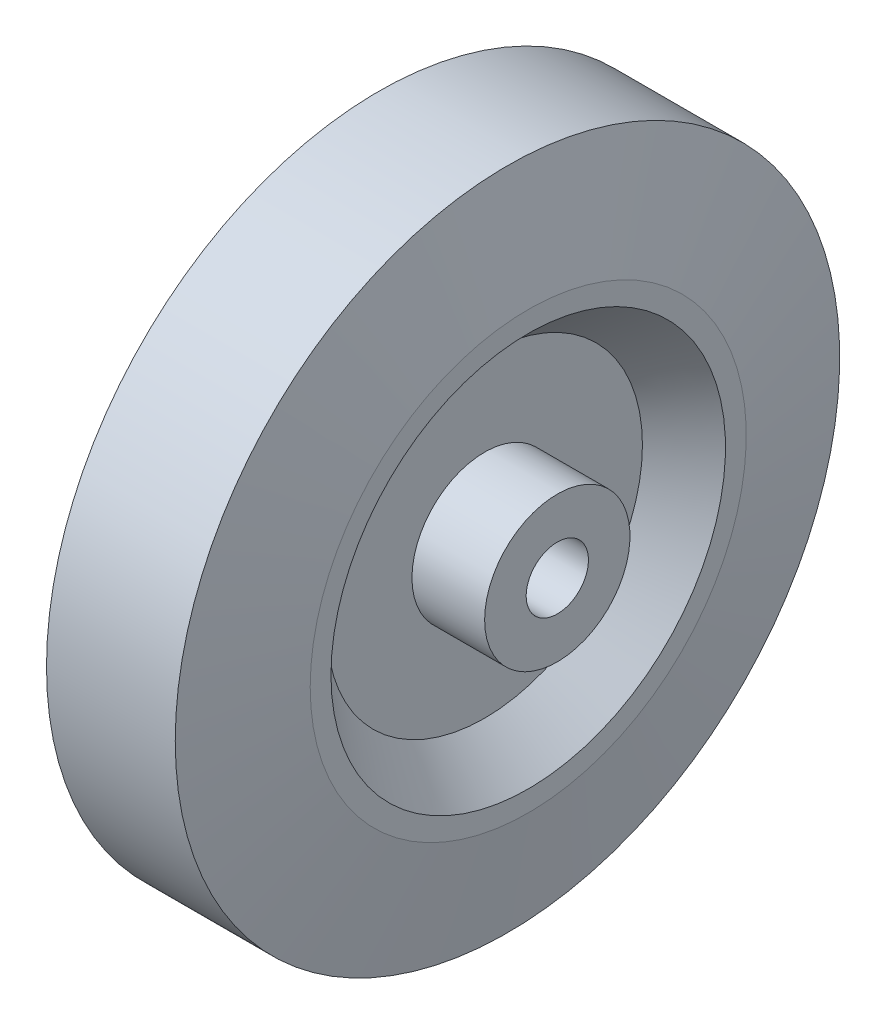
ISO-10303-21;
HEADER;
FILE_DESCRIPTION(('STEP AP214'),'2;1');
FILE_NAME('part.step','',(''),(''),'','','');
FILE_SCHEMA(('AUTOMOTIVE_DESIGN { 1 0 10303 214 1 1 1 1 }'));
ENDSEC;
DATA;
#1=APPLICATION_CONTEXT('core data for automotive mechanical design processes');
#2=APPLICATION_PROTOCOL_DEFINITION('international standard','automotive_design',2000,#1);
#3=PRODUCT_CONTEXT('',#1,'mechanical');
#4=PRODUCT('Part','Part','',(#3));
#5=PRODUCT_RELATED_PRODUCT_CATEGORY('part','',(#4));
#6=PRODUCT_DEFINITION_FORMATION('','',#4);
#7=PRODUCT_DEFINITION_CONTEXT('part definition',#1,'design');
#8=PRODUCT_DEFINITION('design','',#6,#7);
#9=PRODUCT_DEFINITION_SHAPE('','',#8);
#10=(LENGTH_UNIT() NAMED_UNIT(*) SI_UNIT(.MILLI.,.METRE.));
#11=(NAMED_UNIT(*) PLANE_ANGLE_UNIT() SI_UNIT($,.RADIAN.));
#12=(NAMED_UNIT(*) SI_UNIT($,.STERADIAN.) SOLID_ANGLE_UNIT());
#13=UNCERTAINTY_MEASURE_WITH_UNIT(LENGTH_MEASURE(1.E-05),#10,'distance_accuracy_value','');
#14=(GEOMETRIC_REPRESENTATION_CONTEXT(3) GLOBAL_UNCERTAINTY_ASSIGNED_CONTEXT((#13)) GLOBAL_UNIT_ASSIGNED_CONTEXT((#10,
#11,#12)) REPRESENTATION_CONTEXT('',''));
#15=CARTESIAN_POINT('',(0.,0.,0.));
#16=DIRECTION('',(0.,0.,1.));
#17=DIRECTION('',(1.,0.,0.));
#18=AXIS2_PLACEMENT_3D('',#15,#16,#17);
#19=CARTESIAN_POINT('',(20.5,0.,0.));
#20=DIRECTION('',(-1.,0.,0.));
#21=DIRECTION('',(0.,0.,1.));
#22=AXIS2_PLACEMENT_3D('',#19,#20,#21);
#23=CONICAL_SURFACE('',#22,52.5,1.39094282700242);
#24=CARTESIAN_POINT('',(15.5,0.,0.));
#25=DIRECTION('',(-1.,0.,0.));
#26=DIRECTION('',(0.,0.,1.));
#27=AXIS2_PLACEMENT_3D('',#24,#25,#26);
#28=CIRCLE('',#27,80.);
#29=CARTESIAN_POINT('',(15.5,0.,80.));
#30=VERTEX_POINT('',#29);
#31=EDGE_CURVE('E10',#30,#30,#28,.T.);
#32=ORIENTED_EDGE('',*,*,#31,.F.);
#33=EDGE_LOOP('',(#32));
#34=FACE_BOUND('',#33,.T.);
#35=CARTESIAN_POINT('',(20.5,0.,0.));
#36=DIRECTION('',(-1.,0.,0.));
#37=DIRECTION('',(0.,0.,1.));
#38=AXIS2_PLACEMENT_3D('',#35,#36,#37);
#39=CIRCLE('',#38,52.5);
#40=CARTESIAN_POINT('',(20.5,0.,52.5));
#41=VERTEX_POINT('',#40);
#42=EDGE_CURVE('E79',#41,#41,#39,.T.);
#43=ORIENTED_EDGE('',*,*,#42,.T.);
#44=EDGE_LOOP('',(#43));
#45=FACE_BOUND('',#44,.T.);
#46=ADVANCED_FACE('F33',(#34,#45),#23,.T.);
#47=CARTESIAN_POINT('',(-30.7881952117865,0.,0.));
#48=DIRECTION('',(-1.,0.,0.));
#49=DIRECTION('',(0.,0.,1.));
#50=AXIS2_PLACEMENT_3D('',#47,#48,#49);
#51=CYLINDRICAL_SURFACE('',#50,80.);
#52=CARTESIAN_POINT('',(-15.5,0.,0.));
#53=DIRECTION('',(-1.,0.,0.));
#54=DIRECTION('',(0.,0.,1.));
#55=AXIS2_PLACEMENT_3D('',#52,#53,#54);
#56=CIRCLE('',#55,80.);
#57=CARTESIAN_POINT('',(-15.5,0.,80.));
#58=VERTEX_POINT('',#57);
#59=EDGE_CURVE('E39',#58,#58,#56,.T.);
#60=ORIENTED_EDGE('',*,*,#59,.F.);
#61=EDGE_LOOP('',(#60));
#62=FACE_BOUND('',#61,.T.);
#63=ORIENTED_EDGE('',*,*,#31,.T.);
#64=EDGE_LOOP('',(#63));
#65=FACE_BOUND('',#64,.T.);
#66=ADVANCED_FACE('F152',(#62,#65),#51,.T.);
#67=CARTESIAN_POINT('',(-15.5,0.,0.));
#68=DIRECTION('',(1.,0.,0.));
#69=DIRECTION('',(0.,0.,-1.));
#70=AXIS2_PLACEMENT_3D('',#67,#68,#69);
#71=CONICAL_SURFACE('',#70,80.,1.39094282700242);
#72=CARTESIAN_POINT('',(-20.5,0.,0.));
#73=DIRECTION('',(-1.,0.,0.));
#74=DIRECTION('',(0.,0.,1.));
#75=AXIS2_PLACEMENT_3D('',#72,#73,#74);
#76=CIRCLE('',#75,52.5);
#77=CARTESIAN_POINT('',(-20.5,0.,52.5));
#78=VERTEX_POINT('',#77);
#79=EDGE_CURVE('E43',#78,#78,#76,.T.);
#80=ORIENTED_EDGE('',*,*,#79,.F.);
#81=EDGE_LOOP('',(#80));
#82=FACE_BOUND('',#81,.T.);
#83=ORIENTED_EDGE('',*,*,#59,.T.);
#84=EDGE_LOOP('',(#83));
#85=FACE_BOUND('',#84,.T.);
#86=ADVANCED_FACE('F147',(#82,#85),#71,.T.);
#87=CARTESIAN_POINT('',(-20.5,52.5,0.));
#88=DIRECTION('',(1.,0.,0.));
#89=DIRECTION('',(0.,0.,-1.));
#90=AXIS2_PLACEMENT_3D('',#87,#88,#89);
#91=PLANE('',#90);
#92=CARTESIAN_POINT('',(-20.5,0.,0.));
#93=DIRECTION('',(-1.,0.,0.));
#94=DIRECTION('',(0.,0.,1.));
#95=AXIS2_PLACEMENT_3D('',#92,#93,#94);
#96=CIRCLE('',#95,47.5);
#97=CARTESIAN_POINT('',(-20.5,0.,47.5));
#98=VERTEX_POINT('',#97);
#99=EDGE_CURVE('E47',#98,#98,#96,.T.);
#100=ORIENTED_EDGE('',*,*,#99,.F.);
#101=EDGE_LOOP('',(#100));
#102=FACE_BOUND('',#101,.T.);
#103=ORIENTED_EDGE('',*,*,#79,.T.);
#104=EDGE_LOOP('',(#103));
#105=FACE_BOUND('',#104,.T.);
#106=ADVANCED_FACE('F141',(#102,#105),#91,.F.);
#107=CARTESIAN_POINT('',(-20.5,0.,0.));
#108=DIRECTION('',(-1.,0.,0.));
#109=DIRECTION('',(0.,0.,1.));
#110=AXIS2_PLACEMENT_3D('',#107,#108,#109);
#111=CONICAL_SURFACE('',#110,47.5,0.735439767675506);
#112=CARTESIAN_POINT('',(-10.,0.,0.));
#113=DIRECTION('',(-1.,0.,0.));
#114=DIRECTION('',(0.,0.,1.));
#115=AXIS2_PLACEMENT_3D('',#112,#113,#114);
#116=CIRCLE('',#115,38.);
#117=CARTESIAN_POINT('',(-10.,0.,38.));
#118=VERTEX_POINT('',#117);
#119=EDGE_CURVE('E52',#118,#118,#116,.T.);
#120=ORIENTED_EDGE('',*,*,#119,.F.);
#121=EDGE_LOOP('',(#120));
#122=FACE_BOUND('',#121,.T.);
#123=ORIENTED_EDGE('',*,*,#99,.T.);
#124=EDGE_LOOP('',(#123));
#125=FACE_BOUND('',#124,.T.);
#126=ADVANCED_FACE('F135',(#122,#125),#111,.F.);
#127=CARTESIAN_POINT('',(-10.,38.,0.));
#128=DIRECTION('',(1.,0.,0.));
#129=DIRECTION('',(0.,0.,-1.));
#130=AXIS2_PLACEMENT_3D('',#127,#128,#129);
#131=PLANE('',#130);
#132=CARTESIAN_POINT('',(-10.,0.,0.));
#133=DIRECTION('',(-1.,0.,0.));
#134=DIRECTION('',(0.,0.,1.));
#135=AXIS2_PLACEMENT_3D('',#132,#133,#134);
#136=CIRCLE('',#135,17.5);
#137=CARTESIAN_POINT('',(-10.,0.,17.5));
#138=VERTEX_POINT('',#137);
#139=EDGE_CURVE('E55',#138,#138,#136,.T.);
#140=ORIENTED_EDGE('',*,*,#139,.F.);
#141=EDGE_LOOP('',(#140));
#142=FACE_BOUND('',#141,.T.);
#143=ORIENTED_EDGE('',*,*,#119,.T.);
#144=EDGE_LOOP('',(#143));
#145=FACE_BOUND('',#144,.T.);
#146=ADVANCED_FACE('F129',(#142,#145),#131,.F.);
#147=CARTESIAN_POINT('',(-30.7881952117865,0.,0.));
#148=DIRECTION('',(-1.,0.,0.));
#149=DIRECTION('',(0.,0.,1.));
#150=AXIS2_PLACEMENT_3D('',#147,#148,#149);
#151=CYLINDRICAL_SURFACE('',#150,17.5);
#152=CARTESIAN_POINT('',(-27.5,0.,0.));
#153=DIRECTION('',(-1.,0.,0.));
#154=DIRECTION('',(0.,0.,1.));
#155=AXIS2_PLACEMENT_3D('',#152,#153,#154);
#156=CIRCLE('',#155,17.5);
#157=CARTESIAN_POINT('',(-27.5,0.,17.5));
#158=VERTEX_POINT('',#157);
#159=EDGE_CURVE('E58',#158,#158,#156,.T.);
#160=ORIENTED_EDGE('',*,*,#159,.F.);
#161=EDGE_LOOP('',(#160));
#162=FACE_BOUND('',#161,.T.);
#163=ORIENTED_EDGE('',*,*,#139,.T.);
#164=EDGE_LOOP('',(#163));
#165=FACE_BOUND('',#164,.T.);
#166=ADVANCED_FACE('F123',(#162,#165),#151,.T.);
#167=CARTESIAN_POINT('',(-27.5,17.5,0.));
#168=DIRECTION('',(1.,0.,0.));
#169=DIRECTION('',(0.,0.,-1.));
#170=AXIS2_PLACEMENT_3D('',#167,#168,#169);
#171=PLANE('',#170);
#172=CARTESIAN_POINT('',(-27.5,0.,0.));
#173=DIRECTION('',(-1.,0.,0.));
#174=DIRECTION('',(0.,0.,1.));
#175=AXIS2_PLACEMENT_3D('',#172,#173,#174);
#176=CIRCLE('',#175,7.49999999999999);
#177=CARTESIAN_POINT('',(-27.5,0.,7.49999999999999));
#178=VERTEX_POINT('',#177);
#179=EDGE_CURVE('E61',#178,#178,#176,.T.);
#180=ORIENTED_EDGE('',*,*,#179,.F.);
#181=EDGE_LOOP('',(#180));
#182=FACE_BOUND('',#181,.T.);
#183=ORIENTED_EDGE('',*,*,#159,.T.);
#184=EDGE_LOOP('',(#183));
#185=FACE_BOUND('',#184,.T.);
#186=ADVANCED_FACE('F117',(#182,#185),#171,.F.);
#187=CARTESIAN_POINT('',(-30.7881952117865,0.,0.));
#188=DIRECTION('',(-1.,0.,0.));
#189=DIRECTION('',(0.,0.,1.));
#190=AXIS2_PLACEMENT_3D('',#187,#188,#189);
#191=CYLINDRICAL_SURFACE('',#190,7.49999999999999);
#192=CARTESIAN_POINT('',(27.5,0.,0.));
#193=DIRECTION('',(-1.,0.,0.));
#194=DIRECTION('',(0.,0.,1.));
#195=AXIS2_PLACEMENT_3D('',#192,#193,#194);
#196=CIRCLE('',#195,7.49999999999999);
#197=CARTESIAN_POINT('',(27.5,0.,7.49999999999999));
#198=VERTEX_POINT('',#197);
#199=EDGE_CURVE('E64',#198,#198,#196,.T.);
#200=ORIENTED_EDGE('',*,*,#199,.F.);
#201=EDGE_LOOP('',(#200));
#202=FACE_BOUND('',#201,.T.);
#203=ORIENTED_EDGE('',*,*,#179,.T.);
#204=EDGE_LOOP('',(#203));
#205=FACE_BOUND('',#204,.T.);
#206=ADVANCED_FACE('F111',(#202,#205),#191,.F.);
#207=CARTESIAN_POINT('',(27.5,17.5,0.));
#208=DIRECTION('',(-1.,0.,0.));
#209=DIRECTION('',(0.,0.,1.));
#210=AXIS2_PLACEMENT_3D('',#207,#208,#209);
#211=PLANE('',#210);
#212=CARTESIAN_POINT('',(27.5,0.,0.));
#213=DIRECTION('',(-1.,0.,0.));
#214=DIRECTION('',(0.,0.,1.));
#215=AXIS2_PLACEMENT_3D('',#212,#213,#214);
#216=CIRCLE('',#215,17.5);
#217=CARTESIAN_POINT('',(27.5,0.,17.5));
#218=VERTEX_POINT('',#217);
#219=EDGE_CURVE('E67',#218,#218,#216,.T.);
#220=ORIENTED_EDGE('',*,*,#219,.F.);
#221=EDGE_LOOP('',(#220));
#222=FACE_BOUND('',#221,.T.);
#223=ORIENTED_EDGE('',*,*,#199,.T.);
#224=EDGE_LOOP('',(#223));
#225=FACE_BOUND('',#224,.T.);
#226=ADVANCED_FACE('F105',(#222,#225),#211,.F.);
#227=CARTESIAN_POINT('',(-30.7881952117865,0.,0.));
#228=DIRECTION('',(-1.,0.,0.));
#229=DIRECTION('',(0.,0.,1.));
#230=AXIS2_PLACEMENT_3D('',#227,#228,#229);
#231=CYLINDRICAL_SURFACE('',#230,17.5);
#232=CARTESIAN_POINT('',(10.,0.,0.));
#233=DIRECTION('',(-1.,0.,0.));
#234=DIRECTION('',(0.,0.,1.));
#235=AXIS2_PLACEMENT_3D('',#232,#233,#234);
#236=CIRCLE('',#235,17.5);
#237=CARTESIAN_POINT('',(10.,0.,17.5));
#238=VERTEX_POINT('',#237);
#239=EDGE_CURVE('E70',#238,#238,#236,.T.);
#240=ORIENTED_EDGE('',*,*,#239,.F.);
#241=EDGE_LOOP('',(#240));
#242=FACE_BOUND('',#241,.T.);
#243=ORIENTED_EDGE('',*,*,#219,.T.);
#244=EDGE_LOOP('',(#243));
#245=FACE_BOUND('',#244,.T.);
#246=ADVANCED_FACE('F99',(#242,#245),#231,.T.);
#247=CARTESIAN_POINT('',(10.,38.,0.));
#248=DIRECTION('',(-1.,0.,0.));
#249=DIRECTION('',(0.,0.,1.));
#250=AXIS2_PLACEMENT_3D('',#247,#248,#249);
#251=PLANE('',#250);
#252=CARTESIAN_POINT('',(10.,0.,0.));
#253=DIRECTION('',(-1.,0.,0.));
#254=DIRECTION('',(0.,0.,1.));
#255=AXIS2_PLACEMENT_3D('',#252,#253,#254);
#256=CIRCLE('',#255,38.);
#257=CARTESIAN_POINT('',(10.,0.,38.));
#258=VERTEX_POINT('',#257);
#259=EDGE_CURVE('E73',#258,#258,#256,.T.);
#260=ORIENTED_EDGE('',*,*,#259,.F.);
#261=EDGE_LOOP('',(#260));
#262=FACE_BOUND('',#261,.T.);
#263=ORIENTED_EDGE('',*,*,#239,.T.);
#264=EDGE_LOOP('',(#263));
#265=FACE_BOUND('',#264,.T.);
#266=ADVANCED_FACE('F93',(#262,#265),#251,.F.);
#267=CARTESIAN_POINT('',(10.,0.,0.));
#268=DIRECTION('',(1.,0.,0.));
#269=DIRECTION('',(0.,0.,-1.));
#270=AXIS2_PLACEMENT_3D('',#267,#268,#269);
#271=CONICAL_SURFACE('',#270,38.,0.735439767675506);
#272=CARTESIAN_POINT('',(20.5,0.,0.));
#273=DIRECTION('',(-1.,0.,0.));
#274=DIRECTION('',(0.,0.,1.));
#275=AXIS2_PLACEMENT_3D('',#272,#273,#274);
#276=CIRCLE('',#275,47.5);
#277=CARTESIAN_POINT('',(20.5,0.,47.5));
#278=VERTEX_POINT('',#277);
#279=EDGE_CURVE('E76',#278,#278,#276,.T.);
#280=ORIENTED_EDGE('',*,*,#279,.F.);
#281=EDGE_LOOP('',(#280));
#282=FACE_BOUND('',#281,.T.);
#283=ORIENTED_EDGE('',*,*,#259,.T.);
#284=EDGE_LOOP('',(#283));
#285=FACE_BOUND('',#284,.T.);
#286=ADVANCED_FACE('F87',(#282,#285),#271,.F.);
#287=CARTESIAN_POINT('',(20.5,52.5,0.));
#288=DIRECTION('',(-1.,0.,0.));
#289=DIRECTION('',(0.,0.,1.));
#290=AXIS2_PLACEMENT_3D('',#287,#288,#289);
#291=PLANE('',#290);
#292=ORIENTED_EDGE('',*,*,#42,.F.);
#293=EDGE_LOOP('',(#292));
#294=FACE_BOUND('',#293,.T.);
#295=ORIENTED_EDGE('',*,*,#279,.T.);
#296=EDGE_LOOP('',(#295));
#297=FACE_BOUND('',#296,.T.);
#298=ADVANCED_FACE('F84',(#294,#297),#291,.F.);
#299=CLOSED_SHELL('',(#46,#66,#86,#106,#126,#146,#166,#186,#206,#226,#246,#266,#286,#298));
#300=MANIFOLD_SOLID_BREP('B2',#299);
#301=ADVANCED_BREP_SHAPE_REPRESENTATION('',(#18,#300),#14);
#302=SHAPE_DEFINITION_REPRESENTATION(#9,#301);
ENDSEC;
END-ISO-10303-21;
